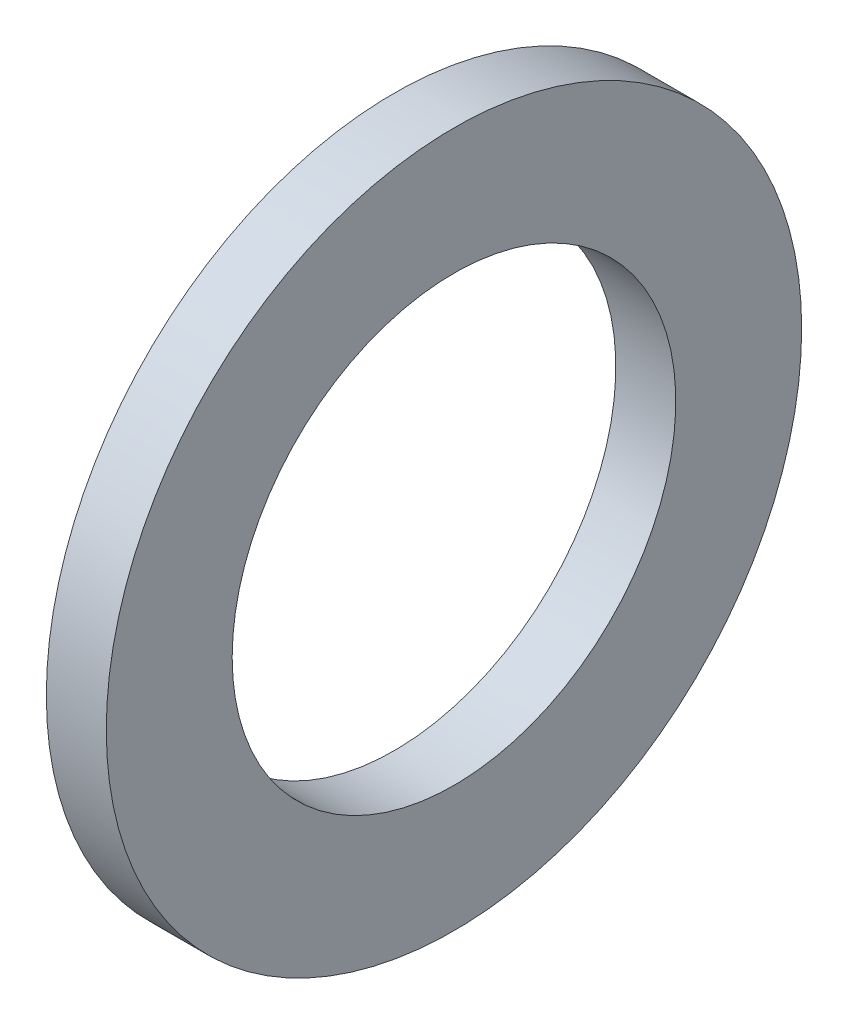
ISO-10303-21;
HEADER;
FILE_DESCRIPTION(('STEP AP214'),'2;1');
FILE_NAME('part.step','',(''),(''),'','','');
FILE_SCHEMA(('AUTOMOTIVE_DESIGN { 1 0 10303 214 1 1 1 1 }'));
ENDSEC;
DATA;
#1=APPLICATION_CONTEXT('core data for automotive mechanical design processes');
#2=APPLICATION_PROTOCOL_DEFINITION('international standard','automotive_design',2000,#1);
#3=PRODUCT_CONTEXT('',#1,'mechanical');
#4=PRODUCT('Part','Part','',(#3));
#5=PRODUCT_RELATED_PRODUCT_CATEGORY('part','',(#4));
#6=PRODUCT_DEFINITION_FORMATION('','',#4);
#7=PRODUCT_DEFINITION_CONTEXT('part definition',#1,'design');
#8=PRODUCT_DEFINITION('design','',#6,#7);
#9=PRODUCT_DEFINITION_SHAPE('','',#8);
#10=(LENGTH_UNIT() NAMED_UNIT(*) SI_UNIT(.MILLI.,.METRE.));
#11=(NAMED_UNIT(*) PLANE_ANGLE_UNIT() SI_UNIT($,.RADIAN.));
#12=(NAMED_UNIT(*) SI_UNIT($,.STERADIAN.) SOLID_ANGLE_UNIT());
#13=UNCERTAINTY_MEASURE_WITH_UNIT(LENGTH_MEASURE(1.E-05),#10,'distance_accuracy_value','');
#14=(GEOMETRIC_REPRESENTATION_CONTEXT(3) GLOBAL_UNCERTAINTY_ASSIGNED_CONTEXT((#13)) GLOBAL_UNIT_ASSIGNED_CONTEXT((#10,
#11,#12)) REPRESENTATION_CONTEXT('',''));
#15=CARTESIAN_POINT('',(0.,0.,0.));
#16=DIRECTION('',(0.,0.,1.));
#17=DIRECTION('',(1.,0.,0.));
#18=AXIS2_PLACEMENT_3D('',#15,#16,#17);
#19=CARTESIAN_POINT('',(-34.9249999999999,0.,0.));
#20=DIRECTION('',(-1.,0.,0.));
#21=DIRECTION('',(0.,0.,1.));
#22=AXIS2_PLACEMENT_3D('',#19,#20,#21);
#23=CYLINDRICAL_SURFACE('',#22,18.5);
#24=CARTESIAN_POINT('',(0.,0.,0.));
#25=DIRECTION('',(-1.,0.,0.));
#26=DIRECTION('',(0.,0.,1.));
#27=AXIS2_PLACEMENT_3D('',#24,#25,#26);
#28=CIRCLE('',#27,18.5);
#29=CARTESIAN_POINT('',(0.,0.,18.5));
#30=VERTEX_POINT('',#29);
#31=EDGE_CURVE('E10',#30,#30,#28,.T.);
#32=ORIENTED_EDGE('',*,*,#31,.F.);
#33=EDGE_LOOP('',(#32));
#34=FACE_BOUND('',#33,.T.);
#35=CARTESIAN_POINT('',(-5.,0.,0.));
#36=DIRECTION('',(-1.,0.,0.));
#37=DIRECTION('',(0.,0.,1.));
#38=AXIS2_PLACEMENT_3D('',#35,#36,#37);
#39=CIRCLE('',#38,18.5);
#40=CARTESIAN_POINT('',(-5.,0.,18.5));
#41=VERTEX_POINT('',#40);
#42=EDGE_CURVE('E44',#41,#41,#39,.T.);
#43=ORIENTED_EDGE('',*,*,#42,.T.);
#44=EDGE_LOOP('',(#43));
#45=FACE_BOUND('',#44,.T.);
#46=ADVANCED_FACE('F30',(#34,#45),#23,.F.);
#47=CARTESIAN_POINT('',(0.,18.5,0.));
#48=DIRECTION('',(-1.,0.,0.));
#49=DIRECTION('',(0.,0.,1.));
#50=AXIS2_PLACEMENT_3D('',#47,#48,#49);
#51=PLANE('',#50);
#52=CARTESIAN_POINT('',(0.,0.,0.));
#53=DIRECTION('',(-1.,0.,0.));
#54=DIRECTION('',(0.,0.,1.));
#55=AXIS2_PLACEMENT_3D('',#52,#53,#54);
#56=CIRCLE('',#55,29.);
#57=CARTESIAN_POINT('',(0.,0.,29.));
#58=VERTEX_POINT('',#57);
#59=EDGE_CURVE('E36',#58,#58,#56,.T.);
#60=ORIENTED_EDGE('',*,*,#59,.F.);
#61=EDGE_LOOP('',(#60));
#62=FACE_BOUND('',#61,.T.);
#63=ORIENTED_EDGE('',*,*,#31,.T.);
#64=EDGE_LOOP('',(#63));
#65=FACE_BOUND('',#64,.T.);
#66=ADVANCED_FACE('F59',(#62,#65),#51,.F.);
#67=CARTESIAN_POINT('',(-34.9249999999999,0.,0.));
#68=DIRECTION('',(-1.,0.,0.));
#69=DIRECTION('',(0.,0.,1.));
#70=AXIS2_PLACEMENT_3D('',#67,#68,#69);
#71=CYLINDRICAL_SURFACE('',#70,29.);
#72=CARTESIAN_POINT('',(-5.,0.,0.));
#73=DIRECTION('',(-1.,0.,0.));
#74=DIRECTION('',(0.,0.,1.));
#75=AXIS2_PLACEMENT_3D('',#72,#73,#74);
#76=CIRCLE('',#75,29.);
#77=CARTESIAN_POINT('',(-5.,0.,29.));
#78=VERTEX_POINT('',#77);
#79=EDGE_CURVE('E40',#78,#78,#76,.T.);
#80=ORIENTED_EDGE('',*,*,#79,.F.);
#81=EDGE_LOOP('',(#80));
#82=FACE_BOUND('',#81,.T.);
#83=ORIENTED_EDGE('',*,*,#59,.T.);
#84=EDGE_LOOP('',(#83));
#85=FACE_BOUND('',#84,.T.);
#86=ADVANCED_FACE('F54',(#82,#85),#71,.T.);
#87=CARTESIAN_POINT('',(-5.,29.,0.));
#88=DIRECTION('',(1.,0.,0.));
#89=DIRECTION('',(0.,0.,-1.));
#90=AXIS2_PLACEMENT_3D('',#87,#88,#89);
#91=PLANE('',#90);
#92=ORIENTED_EDGE('',*,*,#42,.F.);
#93=EDGE_LOOP('',(#92));
#94=FACE_BOUND('',#93,.T.);
#95=ORIENTED_EDGE('',*,*,#79,.T.);
#96=EDGE_LOOP('',(#95));
#97=FACE_BOUND('',#96,.T.);
#98=ADVANCED_FACE('F51',(#94,#97),#91,.F.);
#99=CLOSED_SHELL('',(#46,#66,#86,#98));
#100=MANIFOLD_SOLID_BREP('B2',#99);
#101=ADVANCED_BREP_SHAPE_REPRESENTATION('',(#18,#100),#14);
#102=SHAPE_DEFINITION_REPRESENTATION(#9,#101);
ENDSEC;
END-ISO-10303-21;
